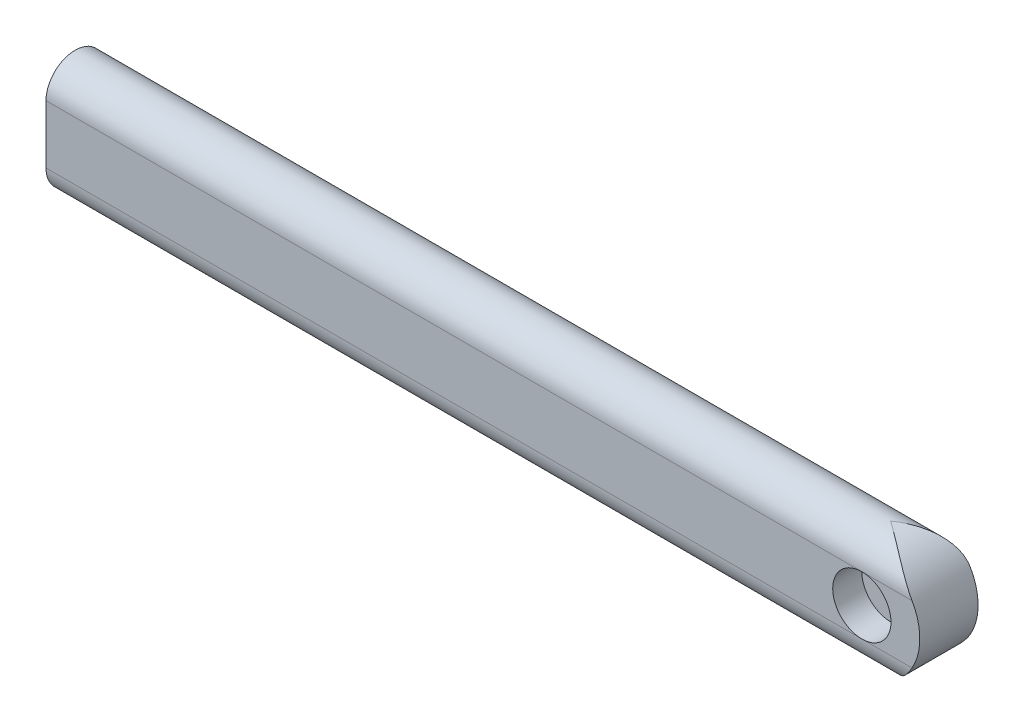
ISO-10303-21;
HEADER;
FILE_DESCRIPTION(('STEP AP214'),'2;1');
FILE_NAME('part.step','',(''),(''),'','','');
FILE_SCHEMA(('AUTOMOTIVE_DESIGN { 1 0 10303 214 1 1 1 1 }'));
ENDSEC;
DATA;
#1=APPLICATION_CONTEXT('core data for automotive mechanical design processes');
#2=APPLICATION_PROTOCOL_DEFINITION('international standard','automotive_design',2000,#1);
#3=PRODUCT_CONTEXT('',#1,'mechanical');
#4=PRODUCT('Part','Part','',(#3));
#5=PRODUCT_RELATED_PRODUCT_CATEGORY('part','',(#4));
#6=PRODUCT_DEFINITION_FORMATION('','',#4);
#7=PRODUCT_DEFINITION_CONTEXT('part definition',#1,'design');
#8=PRODUCT_DEFINITION('design','',#6,#7);
#9=PRODUCT_DEFINITION_SHAPE('','',#8);
#10=(LENGTH_UNIT() NAMED_UNIT(*) SI_UNIT(.MILLI.,.METRE.));
#11=(NAMED_UNIT(*) PLANE_ANGLE_UNIT() SI_UNIT($,.RADIAN.));
#12=(NAMED_UNIT(*) SI_UNIT($,.STERADIAN.) SOLID_ANGLE_UNIT());
#13=UNCERTAINTY_MEASURE_WITH_UNIT(LENGTH_MEASURE(1.E-05),#10,'distance_accuracy_value','');
#14=(GEOMETRIC_REPRESENTATION_CONTEXT(3) GLOBAL_UNCERTAINTY_ASSIGNED_CONTEXT((#13)) GLOBAL_UNIT_ASSIGNED_CONTEXT((#10,
#11,#12)) REPRESENTATION_CONTEXT('',''));
#15=CARTESIAN_POINT('',(0.,0.,0.));
#16=DIRECTION('',(0.,0.,1.));
#17=DIRECTION('',(1.,0.,0.));
#18=AXIS2_PLACEMENT_3D('',#15,#16,#17);
#19=CARTESIAN_POINT('',(-1500.,50.,50.));
#20=DIRECTION('',(0.,0.,1.));
#21=DIRECTION('',(0.,-1.,0.));
#22=AXIS2_PLACEMENT_3D('',#19,#20,#21);
#23=PLANE('',#22);
#24=CARTESIAN_POINT('',(-100.,0.,50.));
#25=DIRECTION('',(0.,0.,1.));
#26=DIRECTION('',(1.,0.,0.));
#27=AXIS2_PLACEMENT_3D('',#24,#25,#26);
#28=CIRCLE('',#27,50.);
#29=CARTESIAN_POINT('',(-100.,-50.,50.));
#30=VERTEX_POINT('',#29);
#31=CARTESIAN_POINT('',(-100.,50.,50.));
#32=VERTEX_POINT('',#31);
#33=EDGE_CURVE('E52',#30,#32,#28,.T.);
#34=ORIENTED_EDGE('',*,*,#33,.F.);
#35=DIRECTION('',(1.,0.,0.));
#36=VECTOR('',#35,1.);
#37=CARTESIAN_POINT('',(-1500.,-50.,50.));
#38=LINE('',#37,#36);
#39=CARTESIAN_POINT('',(-13.8974596215561,-50.,50.));
#40=VERTEX_POINT('',#39);
#41=EDGE_CURVE('E45',#30,#40,#38,.T.);
#42=ORIENTED_EDGE('',*,*,#41,.T.);
#43=CARTESIAN_POINT('',(-100.5,0.,50.));
#44=DIRECTION('',(0.,0.,-1.));
#45=DIRECTION('',(1.,0.,0.));
#46=AXIS2_PLACEMENT_3D('',#43,#44,#45);
#47=CIRCLE('',#46,100.);
#48=CARTESIAN_POINT('',(-13.8974596215561,50.,50.));
#49=VERTEX_POINT('',#48);
#50=EDGE_CURVE('E132',#49,#40,#47,.T.);
#51=ORIENTED_EDGE('',*,*,#50,.F.);
#52=DIRECTION('',(1.,0.,0.));
#53=VECTOR('',#52,1.);
#54=CARTESIAN_POINT('',(-1500.,50.,50.));
#55=LINE('',#54,#53);
#56=EDGE_CURVE('E98',#32,#49,#55,.T.);
#57=ORIENTED_EDGE('',*,*,#56,.F.);
#58=EDGE_LOOP('',(#34,#42,#51,#57));
#59=FACE_BOUND('',#58,.T.);
#60=ADVANCED_FACE('F35',(#59),#23,.T.);
#61=CARTESIAN_POINT('',(-1500.,-50.,0.));
#62=DIRECTION('',(1.,0.,0.));
#63=DIRECTION('',(0.,0.,-1.));
#64=AXIS2_PLACEMENT_3D('',#61,#62,#63);
#65=CYLINDRICAL_SURFACE('',#64,50.);
#66=CARTESIAN_POINT('',(-13.8974596215562,-50.,50.));
#67=CARTESIAN_POINT('',(-14.167649995854,-50.4679873555165,49.9999998007558));
#68=CARTESIAN_POINT('',(-14.4416192976185,-50.9337508197538,49.9934293962166));
#69=CARTESIAN_POINT('',(-14.9968959537458,-51.8604948890862,49.967523935161));
#70=CARTESIAN_POINT('',(-15.2782029459379,-52.3214757286762,49.9481895075052));
#71=CARTESIAN_POINT('',(-16.1325978948247,-53.6964189136298,49.8716245850319));
#72=CARTESIAN_POINT('',(-16.7163910138867,-54.6027822778373,49.7958318045643));
#73=CARTESIAN_POINT('',(-17.9089760109517,-56.3903774565486,49.5980837190025));
#74=CARTESIAN_POINT('',(-18.5177027707405,-57.2716656752587,49.4762425799509));
#75=CARTESIAN_POINT('',(-19.7596885694484,-59.0096854991582,49.1894434712583));
#76=CARTESIAN_POINT('',(-20.3929497718193,-59.8664149271058,49.0244816918261));
#77=CARTESIAN_POINT('',(-21.6734324213071,-61.5424205466508,48.6569489729919));
#78=CARTESIAN_POINT('',(-22.3203524005359,-62.3620451010419,48.4549125571254));
#79=CARTESIAN_POINT('',(-23.6345983823058,-63.9749356816395,48.0145823273887));
#80=CARTESIAN_POINT('',(-24.301927431845,-64.7681977347693,47.77628307829));
#81=CARTESIAN_POINT('',(-25.6556834610754,-66.3279375752905,47.265972624269));
#82=CARTESIAN_POINT('',(-26.3421215353475,-67.0943991943409,46.9939415043326));
#83=CARTESIAN_POINT('',(-27.7322208493559,-68.5995621094816,46.418804555539));
#84=CARTESIAN_POINT('',(-28.4358829638091,-69.3382619908515,46.1156971459805));
#85=CARTESIAN_POINT('',(-29.9942836260111,-70.9253464289168,45.4204403161706));
#86=CARTESIAN_POINT('',(-30.8523135346437,-71.7678878973594,45.0223175554328));
#87=CARTESIAN_POINT('',(-32.5885437497228,-73.412972602083,44.1891718645774));
#88=CARTESIAN_POINT('',(-33.4667449592446,-74.2155140424315,43.7541472799965));
#89=CARTESIAN_POINT('',(-35.241287803999,-75.7806039231371,42.8506342763267));
#90=CARTESIAN_POINT('',(-36.1376286506796,-76.5431540968095,42.3821473096583));
#91=CARTESIAN_POINT('',(-37.9465888555284,-78.0284608717307,41.414862420554));
#92=CARTESIAN_POINT('',(-38.859208066334,-78.7512178329724,40.9160647724124));
#93=CARTESIAN_POINT('',(-41.629644752215,-80.8684334056681,39.3726129429172));
#94=CARTESIAN_POINT('',(-43.5102509086547,-82.2032377531554,38.2859291021442));
#95=CARTESIAN_POINT('',(-46.3666719237667,-84.0885569833704,36.5880523705917));
#96=CARTESIAN_POINT('',(-47.3248624712819,-84.6975897381605,36.0107025499787));
#97=CARTESIAN_POINT('',(-49.252095763952,-85.8774035892217,34.8354004963423));
#98=CARTESIAN_POINT('',(-50.2211378955535,-86.4481868355201,34.237449424193));
#99=CARTESIAN_POINT('',(-52.5638959694379,-87.7758833274168,32.7767150034322));
#100=CARTESIAN_POINT('',(-53.9423825832557,-88.5144293506564,31.9048545880584));
#101=CARTESIAN_POINT('',(-56.7159516976898,-89.9187050026086,30.1293572271052));
#102=CARTESIAN_POINT('',(-58.1110355527095,-90.5844286428923,29.2257176762832));
#103=CARTESIAN_POINT('',(-60.9158757936792,-91.8447706031514,27.3907738433912));
#104=CARTESIAN_POINT('',(-62.3256375455657,-92.4393618499793,26.4594591954103));
#105=CARTESIAN_POINT('',(-65.1571628008992,-93.5585450068019,24.5734715087283));
#106=CARTESIAN_POINT('',(-66.5789260078213,-94.0831386409053,23.6187990460383));
#107=CARTESIAN_POINT('',(-69.4304490146796,-95.0628860868514,21.6910925669564));
#108=CARTESIAN_POINT('',(-70.8601934012765,-95.5181440901881,20.7180886203565));
#109=CARTESIAN_POINT('',(-73.7281443395045,-96.3613085907926,18.7555250353954));
#110=CARTESIAN_POINT('',(-75.166350991151,-96.7492142903645,17.7659652011045));
#111=CARTESIAN_POINT('',(-78.0490582952812,-97.4584912488702,15.7736862170675));
#112=CARTESIAN_POINT('',(-79.4935559060582,-97.7798916545224,14.7709730376944));
#113=CARTESIAN_POINT('',(-82.3879681042622,-98.3571646001634,12.7547679094376));
#114=CARTESIAN_POINT('',(-83.8378825418874,-98.6130389388549,11.7412762572206));
#115=CARTESIAN_POINT('',(-87.8092096569154,-99.2242019805822,8.95803071512362));
#116=CARTESIAN_POINT('',(-90.3349825432086,-99.5143537722498,7.17987598843417));
#117=CARTESIAN_POINT('',(-95.3901714975246,-99.9014908608122,3.61316996350912));
#118=CARTESIAN_POINT('',(-97.9195808435879,-99.9986810635289,1.82463171855725));
#119=CARTESIAN_POINT('',(-100.46557351057,-99.9999955538482,0.0243432040216313));
#120=CARTESIAN_POINT('',(-100.482786770477,-99.9999999982519,0.0121715912153314));
#121=CARTESIAN_POINT('',(-100.5,-100.,0.));
#122=B_SPLINE_CURVE_WITH_KNOTS('',3,(#66,#67,#68,#69,#70,#71,#72,#73,#74,#75,#76,#77,#78,#79,
#80,#81,#82,#83,#84,#85,#86,#87,#88,#89,#90,#91,#92,#93,#94,#95,#96,#97,#98,#99,#100,#101,#102,
#103,#104,#105,#106,#107,#108,#109,#110,#111,#112,#113,#114,#115,#116,#117,#118,#119,#120,#121),
.UNSPECIFIED.,.F.,.F.,(4,2,2,2,2,2,2,2,2,2,2,2,2,2,2,2,2,2,2,2,2,2,2,2,2,2,2,4),(0.,
1.62102700094339,3.24197414274325,6.48248351501531,9.71501095859343,12.9478240987529,
16.1372452280161,19.3271448730606,22.5189368559038,25.7108912704764,29.5096175956622,
33.3085143237615,37.1072462624503,40.9059438299177,48.545122542519,52.3657422350112,
56.1861469877789,61.5555727104082,66.9254396475331,72.2973439093095,77.6691158314684,
83.0327341419506,88.3964159728232,93.7577421056175,99.1189210532384,108.420116135872,
117.71142898975,117.774674544358),.UNSPECIFIED.);
#123=CARTESIAN_POINT('',(-100.5,-100.,0.));
#124=VERTEX_POINT('',#123);
#125=EDGE_CURVE('E105',#40,#124,#122,.T.);
#126=ORIENTED_EDGE('',*,*,#125,.F.);
#127=ORIENTED_EDGE('',*,*,#41,.F.);
#128=CARTESIAN_POINT('',(-1500.,-50.,50.));
#129=VERTEX_POINT('',#128);
#130=EDGE_CURVE('E11',#129,#30,#38,.T.);
#131=ORIENTED_EDGE('',*,*,#130,.F.);
#132=CARTESIAN_POINT('',(-1500.,-50.,0.));
#133=DIRECTION('',(1.,0.,0.));
#134=DIRECTION('',(0.,0.,-1.));
#135=AXIS2_PLACEMENT_3D('',#132,#133,#134);
#136=CIRCLE('',#135,50.);
#137=CARTESIAN_POINT('',(-1500.,-50.,-50.));
#138=VERTEX_POINT('',#137);
#139=EDGE_CURVE('E267',#129,#138,#136,.T.);
#140=ORIENTED_EDGE('',*,*,#139,.T.);
#141=DIRECTION('',(1.,0.,0.));
#142=VECTOR('',#141,1.);
#143=CARTESIAN_POINT('',(-1500.,-50.,-50.));
#144=LINE('',#143,#142);
#145=CARTESIAN_POINT('',(-13.8974596215561,-50.,-50.));
#146=VERTEX_POINT('',#145);
#147=EDGE_CURVE('E40',#138,#146,#144,.T.);
#148=ORIENTED_EDGE('',*,*,#147,.T.);
#149=CARTESIAN_POINT('',(-13.8974596215562,-50.,-50.));
#150=CARTESIAN_POINT('',(-14.167649995854,-50.4679873555165,-49.9999998007558));
#151=CARTESIAN_POINT('',(-14.4416192976185,-50.9337508197538,-49.9934293962166));
#152=CARTESIAN_POINT('',(-14.9968959537458,-51.8604948890862,-49.967523935161));
#153=CARTESIAN_POINT('',(-15.2782029459379,-52.3214757286762,-49.9481895075052));
#154=CARTESIAN_POINT('',(-16.1325978948247,-53.6964189136298,-49.8716245850319));
#155=CARTESIAN_POINT('',(-16.7163910138867,-54.6027822778373,-49.7958318045643));
#156=CARTESIAN_POINT('',(-17.9089760109517,-56.3903774565486,-49.5980837190025));
#157=CARTESIAN_POINT('',(-18.5177027707405,-57.2716656752587,-49.4762425799509));
#158=CARTESIAN_POINT('',(-19.7596885694484,-59.0096854991581,-49.1894434712583));
#159=CARTESIAN_POINT('',(-20.3929497718193,-59.8664149271058,-49.0244816918261));
#160=CARTESIAN_POINT('',(-21.6734324213071,-61.5424205466508,-48.6569489729919));
#161=CARTESIAN_POINT('',(-22.3203524005359,-62.3620451010419,-48.4549125571255));
#162=CARTESIAN_POINT('',(-23.6345983823058,-63.9749356816395,-48.0145823273887));
#163=CARTESIAN_POINT('',(-24.301927431845,-64.7681977347693,-47.77628307829));
#164=CARTESIAN_POINT('',(-25.6556834610754,-66.3279375752905,-47.265972624269));
#165=CARTESIAN_POINT('',(-26.3421215353475,-67.0943991943409,-46.9939415043326));
#166=CARTESIAN_POINT('',(-27.7322208493559,-68.5995621094816,-46.4188045555391));
#167=CARTESIAN_POINT('',(-28.4358829638091,-69.3382619908515,-46.1156971459805));
#168=CARTESIAN_POINT('',(-29.9942836260111,-70.9253464289168,-45.4204403161706));
#169=CARTESIAN_POINT('',(-30.8523135346437,-71.7678878973595,-45.0223175554328));
#170=CARTESIAN_POINT('',(-32.5885437497228,-73.412972602083,-44.1891718645774));
#171=CARTESIAN_POINT('',(-33.4667449592446,-74.2155140424316,-43.7541472799965));
#172=CARTESIAN_POINT('',(-35.241287803999,-75.7806039231371,-42.8506342763267));
#173=CARTESIAN_POINT('',(-36.1376286506796,-76.5431540968095,-42.3821473096583));
#174=CARTESIAN_POINT('',(-37.9465888555284,-78.0284608717307,-41.414862420554));
#175=CARTESIAN_POINT('',(-38.8592080663341,-78.7512178329724,-40.9160647724124));
#176=CARTESIAN_POINT('',(-41.6296447522151,-80.8684334056681,-39.3726129429172));
#177=CARTESIAN_POINT('',(-43.5102509086547,-82.2032377531554,-38.2859291021442));
#178=CARTESIAN_POINT('',(-46.3666719237668,-84.0885569833704,-36.5880523705917));
#179=CARTESIAN_POINT('',(-47.3248624712819,-84.6975897381605,-36.0107025499787));
#180=CARTESIAN_POINT('',(-49.2520957639521,-85.8774035892217,-34.8354004963423));
#181=CARTESIAN_POINT('',(-50.2211378955535,-86.4481868355201,-34.237449424193));
#182=CARTESIAN_POINT('',(-52.5638959694379,-87.7758833274168,-32.7767150034322));
#183=CARTESIAN_POINT('',(-53.9423825832557,-88.5144293506564,-31.9048545880584));
#184=CARTESIAN_POINT('',(-56.7159516976898,-89.9187050026086,-30.1293572271052));
#185=CARTESIAN_POINT('',(-58.1110355527095,-90.5844286428923,-29.2257176762832));
#186=CARTESIAN_POINT('',(-60.9158757936792,-91.8447706031514,-27.3907738433912));
#187=CARTESIAN_POINT('',(-62.3256375455657,-92.4393618499793,-26.4594591954103));
#188=CARTESIAN_POINT('',(-65.1571628008992,-93.5585450068019,-24.5734715087283));
#189=CARTESIAN_POINT('',(-66.5789260078213,-94.0831386409053,-23.6187990460383));
#190=CARTESIAN_POINT('',(-69.4304490146797,-95.0628860868514,-21.6910925669564));
#191=CARTESIAN_POINT('',(-70.8601934012765,-95.5181440901882,-20.7180886203565));
#192=CARTESIAN_POINT('',(-73.7281443395045,-96.3613085907926,-18.7555250353954));
#193=CARTESIAN_POINT('',(-75.166350991151,-96.7492142903645,-17.7659652011045));
#194=CARTESIAN_POINT('',(-78.0490582952813,-97.4584912488702,-15.7736862170675));
#195=CARTESIAN_POINT('',(-79.4935559060582,-97.7798916545224,-14.7709730376943));
#196=CARTESIAN_POINT('',(-82.3879681042621,-98.3571646001634,-12.7547679094376));
#197=CARTESIAN_POINT('',(-83.8378825418874,-98.6130389388549,-11.7412762572206));
#198=CARTESIAN_POINT('',(-87.8092096569154,-99.2242019805822,-8.95803071512362));
#199=CARTESIAN_POINT('',(-90.3349825432084,-99.5143537722498,-7.17987598843404));
#200=CARTESIAN_POINT('',(-95.3901714975245,-99.9014908608122,-3.61316996350912));
#201=CARTESIAN_POINT('',(-97.9195808435881,-99.9986810635289,-1.82463171855753));
#202=CARTESIAN_POINT('',(-100.46557351057,-99.9999955538482,-0.0243432040216504));
#203=CARTESIAN_POINT('',(-100.482786770477,-99.9999999982519,-0.0121715912153479));
#204=CARTESIAN_POINT('',(-100.5,-100.,0.));
#205=B_SPLINE_CURVE_WITH_KNOTS('',3,(#149,#150,#151,#152,#153,#154,#155,#156,#157,#158,#159,
#160,#161,#162,#163,#164,#165,#166,#167,#168,#169,#170,#171,#172,#173,#174,#175,#176,#177,#178,
#179,#180,#181,#182,#183,#184,#185,#186,#187,#188,#189,#190,#191,#192,#193,#194,#195,#196,#197,
#198,#199,#200,#201,#202,#203,#204),.UNSPECIFIED.,.F.,.F.,(4,2,2,2,2,2,2,2,2,2,2,2,2,2,2,2,2,2,
2,2,2,2,2,2,2,2,2,4),(0.,1.62102700094338,3.24197414274325,6.48248351501531,9.71501095859341,
12.9478240987529,16.1372452280161,19.3271448730606,22.5189368559038,25.7108912704764,
29.5096175956622,33.3085143237615,37.1072462624503,40.9059438299177,48.545122542519,
52.3657422350112,56.186146987779,61.5555727104082,66.9254396475331,72.2973439093095,
77.6691158314684,83.0327341419506,88.3964159728232,93.7577421056175,99.1189210532384,
108.420116135871,117.71142898975,117.774674544358),.UNSPECIFIED.);
#206=EDGE_CURVE('E60',#124,#146,#205,.F.);
#207=ORIENTED_EDGE('',*,*,#206,.F.);
#208=EDGE_LOOP('',(#126,#127,#131,#140,#148,#207));
#209=FACE_BOUND('',#208,.T.);
#210=ADVANCED_FACE('F37',(#209),#65,.T.);
#211=EDGE_CURVE('E88',#32,#30,#28,.T.);
#212=ORIENTED_EDGE('',*,*,#211,.F.);
#213=CARTESIAN_POINT('',(-1500.,50.,50.));
#214=VERTEX_POINT('',#213);
#215=EDGE_CURVE('E106',#214,#32,#55,.T.);
#216=ORIENTED_EDGE('',*,*,#215,.F.);
#217=DIRECTION('',(0.,-1.,0.));
#218=VECTOR('',#217,1.);
#219=CARTESIAN_POINT('',(-1500.,50.,50.));
#220=LINE('',#219,#218);
#221=EDGE_CURVE('E110',#214,#129,#220,.T.);
#222=ORIENTED_EDGE('',*,*,#221,.T.);
#223=ORIENTED_EDGE('',*,*,#130,.T.);
#224=EDGE_LOOP('',(#212,#216,#222,#223));
#225=FACE_BOUND('',#224,.T.);
#226=ADVANCED_FACE('F108',(#225),#23,.T.);
#227=CARTESIAN_POINT('',(-1500.,50.,0.));
#228=DIRECTION('',(1.,0.,0.));
#229=DIRECTION('',(0.,0.,-1.));
#230=AXIS2_PLACEMENT_3D('',#227,#228,#229);
#231=CYLINDRICAL_SURFACE('',#230,50.);
#232=CARTESIAN_POINT('',(-13.8974596215562,50.,-50.));
#233=CARTESIAN_POINT('',(-14.167649995854,50.4679873555165,-49.9999998007558));
#234=CARTESIAN_POINT('',(-14.4416192976185,50.9337508197537,-49.9934293962166));
#235=CARTESIAN_POINT('',(-14.9968959537458,51.8604948890861,-49.967523935161));
#236=CARTESIAN_POINT('',(-15.2782029459379,52.3214757286762,-49.9481895075052));
#237=CARTESIAN_POINT('',(-16.1325978948247,53.6964189136297,-49.8716245850319));
#238=CARTESIAN_POINT('',(-16.7163910138867,54.6027822778372,-49.7958318045643));
#239=CARTESIAN_POINT('',(-17.9089760109516,56.3903774565485,-49.5980837190026));
#240=CARTESIAN_POINT('',(-18.5177027707404,57.2716656752585,-49.4762425799509));
#241=CARTESIAN_POINT('',(-19.7596885694482,59.0096854991579,-49.1894434712583));
#242=CARTESIAN_POINT('',(-20.3929497718191,59.8664149271056,-49.0244816918262));
#243=CARTESIAN_POINT('',(-21.6734324213069,61.5424205466505,-48.6569489729919));
#244=CARTESIAN_POINT('',(-22.3203524005357,62.3620451010417,-48.4549125571255));
#245=CARTESIAN_POINT('',(-23.6345983823057,63.9749356816393,-48.0145823273887));
#246=CARTESIAN_POINT('',(-24.3019274318449,64.7681977347692,-47.77628307829));
#247=CARTESIAN_POINT('',(-25.6556834610753,66.3279375752904,-47.265972624269));
#248=CARTESIAN_POINT('',(-26.3421215353474,67.0943991943408,-46.9939415043326));
#249=CARTESIAN_POINT('',(-27.7322208493559,68.5995621094816,-46.4188045555391));
#250=CARTESIAN_POINT('',(-28.4358829638091,69.3382619908515,-46.1156971459805));
#251=CARTESIAN_POINT('',(-29.9942836260111,70.9253464289168,-45.4204403161706));
#252=CARTESIAN_POINT('',(-30.8523135346437,71.7678878973595,-45.0223175554328));
#253=CARTESIAN_POINT('',(-32.5885437497228,73.412972602083,-44.1891718645774));
#254=CARTESIAN_POINT('',(-33.4667449592446,74.2155140424316,-43.7541472799965));
#255=CARTESIAN_POINT('',(-35.241287803999,75.7806039231371,-42.8506342763267));
#256=CARTESIAN_POINT('',(-36.1376286506796,76.5431540968096,-42.3821473096583));
#257=CARTESIAN_POINT('',(-37.9465888555285,78.0284608717308,-41.414862420554));
#258=CARTESIAN_POINT('',(-38.8592080663342,78.7512178329725,-40.9160647724123));
#259=CARTESIAN_POINT('',(-41.6296447522152,80.8684334056681,-39.3726129429171));
#260=CARTESIAN_POINT('',(-43.5102509086548,82.2032377531554,-38.2859291021442));
#261=CARTESIAN_POINT('',(-46.3666719237668,84.0885569833704,-36.5880523705916));
#262=CARTESIAN_POINT('',(-47.324862471282,84.6975897381605,-36.0107025499786));
#263=CARTESIAN_POINT('',(-49.2520957639521,85.8774035892217,-34.8354004963423));
#264=CARTESIAN_POINT('',(-50.2211378955535,86.4481868355201,-34.237449424193));
#265=CARTESIAN_POINT('',(-52.5638959694379,87.7758833274168,-32.7767150034322));
#266=CARTESIAN_POINT('',(-53.9423825832557,88.5144293506563,-31.9048545880584));
#267=CARTESIAN_POINT('',(-56.7159516976898,89.9187050026086,-30.1293572271052));
#268=CARTESIAN_POINT('',(-58.1110355527095,90.5844286428923,-29.2257176762832));
#269=CARTESIAN_POINT('',(-60.9158757936791,91.8447706031514,-27.3907738433912));
#270=CARTESIAN_POINT('',(-62.3256375455656,92.4393618499793,-26.4594591954103));
#271=CARTESIAN_POINT('',(-65.1571628008991,93.5585450068019,-24.5734715087284));
#272=CARTESIAN_POINT('',(-66.5789260078212,94.0831386409053,-23.6187990460384));
#273=CARTESIAN_POINT('',(-69.4304490146796,95.0628860868514,-21.6910925669565));
#274=CARTESIAN_POINT('',(-70.8601934012764,95.5181440901881,-20.7180886203566));
#275=CARTESIAN_POINT('',(-73.7281443395044,96.3613085907926,-18.7555250353955));
#276=CARTESIAN_POINT('',(-75.1663509911509,96.7492142903644,-17.7659652011046));
#277=CARTESIAN_POINT('',(-78.0490582952812,97.4584912488702,-15.7736862170674));
#278=CARTESIAN_POINT('',(-79.493555906058,97.7798916545224,-14.7709730376942));
#279=CARTESIAN_POINT('',(-82.3879681042621,98.3571646001634,-12.7547679094376));
#280=CARTESIAN_POINT('',(-83.8378825418876,98.6130389388549,-11.7412762572209));
#281=CARTESIAN_POINT('',(-87.8092096569148,99.2242019805822,-8.95803071512287));
#282=CARTESIAN_POINT('',(-90.3349825432059,99.51435377225,-7.17987598843052));
#283=CARTESIAN_POINT('',(-95.3901714975268,99.901490860812,-3.61316996351253));
#284=CARTESIAN_POINT('',(-97.9195808435973,99.9986810635282,-1.8246317185706));
#285=CARTESIAN_POINT('',(-100.46557351057,99.9999955538481,-0.0243432040218492));
#286=CARTESIAN_POINT('',(-100.482786770477,99.9999999982519,-0.0121715912154409));
#287=CARTESIAN_POINT('',(-100.5,100.,0.));
#288=B_SPLINE_CURVE_WITH_KNOTS('',3,(#232,#233,#234,#235,#236,#237,#238,#239,#240,#241,#242,
#243,#244,#245,#246,#247,#248,#249,#250,#251,#252,#253,#254,#255,#256,#257,#258,#259,#260,#261,
#262,#263,#264,#265,#266,#267,#268,#269,#270,#271,#272,#273,#274,#275,#276,#277,#278,#279,#280,
#281,#282,#283,#284,#285,#286,#287),.UNSPECIFIED.,.F.,.F.,(4,2,2,2,2,2,2,2,2,2,2,2,2,2,2,2,2,2,
2,2,2,2,2,2,2,2,2,4),(0.,1.62102700094334,3.24197414274317,6.48248351501515,9.71501095859318,
12.9478240987526,16.1372452280159,19.3271448730605,22.5189368559037,25.7108912704764,
29.5096175956622,33.3085143237615,37.1072462624504,40.9059438299179,48.5451225425191,
52.3657422350113,56.186146987779,61.5555727104081,66.9254396475331,72.2973439093094,
77.6691158314682,83.0327341419504,88.3964159728231,93.7577421056174,99.1189210532383,
108.420116135871,117.71142898975,117.774674544358),.UNSPECIFIED.);
#289=CARTESIAN_POINT('',(-13.8974596215561,50.,-50.));
#290=VERTEX_POINT('',#289);
#291=CARTESIAN_POINT('',(-100.5,100.,0.));
#292=VERTEX_POINT('',#291);
#293=EDGE_CURVE('E133',#290,#292,#288,.T.);
#294=ORIENTED_EDGE('',*,*,#293,.F.);
#295=DIRECTION('',(1.,0.,0.));
#296=VECTOR('',#295,1.);
#297=CARTESIAN_POINT('',(-1500.,50.,-50.));
#298=LINE('',#297,#296);
#299=CARTESIAN_POINT('',(-1500.,50.,-50.));
#300=VERTEX_POINT('',#299);
#301=EDGE_CURVE('E117',#300,#290,#298,.T.);
#302=ORIENTED_EDGE('',*,*,#301,.F.);
#303=CARTESIAN_POINT('',(-1500.,50.,0.));
#304=DIRECTION('',(1.,0.,0.));
#305=DIRECTION('',(0.,0.,-1.));
#306=AXIS2_PLACEMENT_3D('',#303,#304,#305);
#307=CIRCLE('',#306,50.);
#308=EDGE_CURVE('E114',#300,#214,#307,.T.);
#309=ORIENTED_EDGE('',*,*,#308,.T.);
#310=ORIENTED_EDGE('',*,*,#215,.T.);
#311=ORIENTED_EDGE('',*,*,#56,.T.);
#312=CARTESIAN_POINT('',(-13.8974596215562,50.,50.));
#313=CARTESIAN_POINT('',(-14.167649995854,50.4679873555165,49.9999998007558));
#314=CARTESIAN_POINT('',(-14.4416192976185,50.9337508197537,49.9934293962166));
#315=CARTESIAN_POINT('',(-14.9968959537458,51.8604948890861,49.967523935161));
#316=CARTESIAN_POINT('',(-15.2782029459379,52.3214757286762,49.9481895075052));
#317=CARTESIAN_POINT('',(-16.1325978948247,53.6964189136297,49.8716245850319));
#318=CARTESIAN_POINT('',(-16.7163910138867,54.6027822778372,49.7958318045643));
#319=CARTESIAN_POINT('',(-17.9089760109516,56.3903774565485,49.5980837190026));
#320=CARTESIAN_POINT('',(-18.5177027707404,57.2716656752585,49.4762425799509));
#321=CARTESIAN_POINT('',(-19.7596885694482,59.0096854991579,49.1894434712583));
#322=CARTESIAN_POINT('',(-20.3929497718191,59.8664149271056,49.0244816918262));
#323=CARTESIAN_POINT('',(-21.6734324213069,61.5424205466505,48.6569489729919));
#324=CARTESIAN_POINT('',(-22.3203524005357,62.3620451010417,48.4549125571255));
#325=CARTESIAN_POINT('',(-23.6345983823057,63.9749356816394,48.0145823273888));
#326=CARTESIAN_POINT('',(-24.3019274318449,64.7681977347692,47.77628307829));
#327=CARTESIAN_POINT('',(-25.6556834610753,66.3279375752904,47.265972624269));
#328=CARTESIAN_POINT('',(-26.3421215353474,67.0943991943409,46.9939415043326));
#329=CARTESIAN_POINT('',(-27.7322208493559,68.5995621094816,46.4188045555391));
#330=CARTESIAN_POINT('',(-28.4358829638091,69.3382619908515,46.1156971459805));
#331=CARTESIAN_POINT('',(-29.9942836260111,70.9253464289168,45.4204403161706));
#332=CARTESIAN_POINT('',(-30.8523135346437,71.7678878973595,45.0223175554328));
#333=CARTESIAN_POINT('',(-32.5885437497228,73.4129726020831,44.1891718645774));
#334=CARTESIAN_POINT('',(-33.4667449592446,74.2155140424316,43.7541472799965));
#335=CARTESIAN_POINT('',(-35.241287803999,75.7806039231372,42.8506342763267));
#336=CARTESIAN_POINT('',(-36.1376286506796,76.5431540968096,42.3821473096583));
#337=CARTESIAN_POINT('',(-37.9465888555285,78.0284608717308,41.414862420554));
#338=CARTESIAN_POINT('',(-38.8592080663342,78.7512178329725,40.9160647724123));
#339=CARTESIAN_POINT('',(-41.6296447522152,80.8684334056681,39.3726129429171));
#340=CARTESIAN_POINT('',(-43.5102509086548,82.2032377531554,38.2859291021442));
#341=CARTESIAN_POINT('',(-46.3666719237668,84.0885569833704,36.5880523705916));
#342=CARTESIAN_POINT('',(-47.3248624712819,84.6975897381605,36.0107025499786));
#343=CARTESIAN_POINT('',(-49.2520957639521,85.8774035892217,34.8354004963423));
#344=CARTESIAN_POINT('',(-50.2211378955535,86.4481868355201,34.237449424193));
#345=CARTESIAN_POINT('',(-52.5638959694379,87.7758833274168,32.7767150034322));
#346=CARTESIAN_POINT('',(-53.9423825832557,88.5144293506563,31.9048545880584));
#347=CARTESIAN_POINT('',(-56.7159516976898,89.9187050026086,30.1293572271052));
#348=CARTESIAN_POINT('',(-58.1110355527095,90.5844286428923,29.2257176762832));
#349=CARTESIAN_POINT('',(-60.9158757936792,91.8447706031514,27.3907738433912));
#350=CARTESIAN_POINT('',(-62.3256375455657,92.4393618499793,26.4594591954104));
#351=CARTESIAN_POINT('',(-65.1571628008991,93.5585450068019,24.5734715087284));
#352=CARTESIAN_POINT('',(-66.5789260078212,94.0831386409053,23.6187990460384));
#353=CARTESIAN_POINT('',(-69.4304490146796,95.0628860868514,21.6910925669565));
#354=CARTESIAN_POINT('',(-70.8601934012764,95.5181440901881,20.7180886203566));
#355=CARTESIAN_POINT('',(-73.7281443395044,96.3613085907926,18.7555250353955));
#356=CARTESIAN_POINT('',(-75.166350991151,96.7492142903644,17.7659652011046));
#357=CARTESIAN_POINT('',(-78.0490582952812,97.4584912488702,15.7736862170674));
#358=CARTESIAN_POINT('',(-79.4935559060581,97.7798916545224,14.7709730376942));
#359=CARTESIAN_POINT('',(-82.3879681042622,98.3571646001634,12.7547679094376));
#360=CARTESIAN_POINT('',(-83.8378825418877,98.6130389388549,11.7412762572209));
#361=CARTESIAN_POINT('',(-87.8092096569148,99.2242019805822,8.95803071512283));
#362=CARTESIAN_POINT('',(-90.3349825432058,99.51435377225,7.17987598843043));
#363=CARTESIAN_POINT('',(-95.3901714975269,99.901490860812,3.61316996351262));
#364=CARTESIAN_POINT('',(-97.9195808435975,99.9986810635282,1.82463171857092));
#365=CARTESIAN_POINT('',(-100.46557351057,99.9999955538481,0.0243432040218691));
#366=CARTESIAN_POINT('',(-100.482786770477,99.9999999982519,0.0121715912154578));
#367=CARTESIAN_POINT('',(-100.5,100.,0.));
#368=B_SPLINE_CURVE_WITH_KNOTS('',3,(#312,#313,#314,#315,#316,#317,#318,#319,#320,#321,#322,
#323,#324,#325,#326,#327,#328,#329,#330,#331,#332,#333,#334,#335,#336,#337,#338,#339,#340,#341,
#342,#343,#344,#345,#346,#347,#348,#349,#350,#351,#352,#353,#354,#355,#356,#357,#358,#359,#360,
#361,#362,#363,#364,#365,#366,#367),.UNSPECIFIED.,.F.,.F.,(4,2,2,2,2,2,2,2,2,2,2,2,2,2,2,2,2,2,
2,2,2,2,2,2,2,2,2,4),(0.,1.62102700094334,3.24197414274317,6.48248351501515,9.71501095859318,
12.9478240987526,16.1372452280159,19.3271448730605,22.5189368559037,25.7108912704764,
29.5096175956622,33.3085143237615,37.1072462624504,40.9059438299179,48.5451225425191,
52.3657422350113,56.186146987779,61.5555727104081,66.9254396475331,72.2973439093094,
77.6691158314683,83.0327341419505,88.3964159728232,93.7577421056175,99.1189210532384,
108.420116135871,117.71142898975,117.774674544358),.UNSPECIFIED.);
#369=EDGE_CURVE('E130',#292,#49,#368,.F.);
#370=ORIENTED_EDGE('',*,*,#369,.F.);
#371=EDGE_LOOP('',(#294,#302,#309,#310,#311,#370));
#372=FACE_BOUND('',#371,.T.);
#373=ADVANCED_FACE('F129',(#372),#231,.T.);
#374=CARTESIAN_POINT('',(-1500.,50.,-50.));
#375=DIRECTION('',(0.,0.,-1.));
#376=DIRECTION('',(0.,1.,0.));
#377=AXIS2_PLACEMENT_3D('',#374,#375,#376);
#378=PLANE('',#377);
#379=CARTESIAN_POINT('',(-100.5,0.,-50.));
#380=DIRECTION('',(0.,0.,-1.));
#381=DIRECTION('',(1.,0.,0.));
#382=AXIS2_PLACEMENT_3D('',#379,#380,#381);
#383=CIRCLE('',#382,100.);
#384=EDGE_CURVE('E134',#290,#146,#383,.T.);
#385=ORIENTED_EDGE('',*,*,#384,.T.);
#386=ORIENTED_EDGE('',*,*,#147,.F.);
#387=DIRECTION('',(0.,1.,0.));
#388=VECTOR('',#387,1.);
#389=CARTESIAN_POINT('',(-1500.,50.,-50.));
#390=LINE('',#389,#388);
#391=EDGE_CURVE('E118',#138,#300,#390,.T.);
#392=ORIENTED_EDGE('',*,*,#391,.T.);
#393=ORIENTED_EDGE('',*,*,#301,.T.);
#394=EDGE_LOOP('',(#385,#386,#392,#393));
#395=FACE_BOUND('',#394,.T.);
#396=ADVANCED_FACE('F158',(#395),#378,.T.);
#397=CARTESIAN_POINT('',(-1500.,-50.,0.));
#398=DIRECTION('',(1.,0.,0.));
#399=DIRECTION('',(0.,0.,-1.));
#400=AXIS2_PLACEMENT_3D('',#397,#398,#399);
#401=PLANE('',#400);
#402=CARTESIAN_POINT('',(-1500.,50.,0.));
#403=DIRECTION('',(-1.,0.,0.));
#404=DIRECTION('',(0.,0.,1.));
#405=AXIS2_PLACEMENT_3D('',#402,#403,#404);
#406=CIRCLE('',#405,25.);
#407=CARTESIAN_POINT('',(-1500.,50.,25.));
#408=VERTEX_POINT('',#407);
#409=EDGE_CURVE('E253',#408,#408,#406,.T.);
#410=ORIENTED_EDGE('',*,*,#409,.F.);
#411=EDGE_LOOP('',(#410));
#412=FACE_BOUND('',#411,.T.);
#413=CARTESIAN_POINT('',(-1500.,-50.,0.));
#414=DIRECTION('',(-1.,0.,0.));
#415=DIRECTION('',(0.,0.,1.));
#416=AXIS2_PLACEMENT_3D('',#413,#414,#415);
#417=CIRCLE('',#416,25.);
#418=CARTESIAN_POINT('',(-1500.,-50.,25.));
#419=VERTEX_POINT('',#418);
#420=EDGE_CURVE('E261',#419,#419,#417,.T.);
#421=ORIENTED_EDGE('',*,*,#420,.F.);
#422=EDGE_LOOP('',(#421));
#423=FACE_BOUND('',#422,.T.);
#424=ORIENTED_EDGE('',*,*,#139,.F.);
#425=ORIENTED_EDGE('',*,*,#221,.F.);
#426=ORIENTED_EDGE('',*,*,#308,.F.);
#427=ORIENTED_EDGE('',*,*,#391,.F.);
#428=EDGE_LOOP('',(#424,#425,#426,#427));
#429=FACE_BOUND('',#428,.T.);
#430=ADVANCED_FACE('F161',(#412,#423,#429),#401,.F.);
#431=CARTESIAN_POINT('',(-100.5,0.,-50.));
#432=DIRECTION('',(0.,0.,1.));
#433=DIRECTION('',(1.,0.,0.));
#434=AXIS2_PLACEMENT_3D('',#431,#432,#433);
#435=CYLINDRICAL_SURFACE('',#434,100.);
#436=ORIENTED_EDGE('',*,*,#125,.T.);
#437=ORIENTED_EDGE('',*,*,#206,.T.);
#438=ORIENTED_EDGE('',*,*,#384,.F.);
#439=ORIENTED_EDGE('',*,*,#293,.T.);
#440=ORIENTED_EDGE('',*,*,#369,.T.);
#441=ORIENTED_EDGE('',*,*,#50,.T.);
#442=EDGE_LOOP('',(#436,#437,#438,#439,#440,#441));
#443=FACE_BOUND('',#442,.T.);
#444=ADVANCED_FACE('F131',(#443),#435,.T.);
#445=CARTESIAN_POINT('',(-100.,0.,0.));
#446=DIRECTION('',(0.,0.,1.));
#447=DIRECTION('',(1.,0.,0.));
#448=AXIS2_PLACEMENT_3D('',#445,#446,#447);
#449=CYLINDRICAL_SURFACE('',#448,50.);
#450=CARTESIAN_POINT('',(-100.,0.,0.));
#451=DIRECTION('',(0.,0.,1.));
#452=DIRECTION('',(1.,0.,0.));
#453=AXIS2_PLACEMENT_3D('',#450,#451,#452);
#454=CIRCLE('',#453,50.);
#455=CARTESIAN_POINT('',(-50.,0.,0.));
#456=VERTEX_POINT('',#455);
#457=EDGE_CURVE('E92',#456,#456,#454,.T.);
#458=ORIENTED_EDGE('',*,*,#457,.F.);
#459=EDGE_LOOP('',(#458));
#460=FACE_BOUND('',#459,.T.);
#461=ORIENTED_EDGE('',*,*,#211,.T.);
#462=ORIENTED_EDGE('',*,*,#33,.T.);
#463=EDGE_LOOP('',(#461,#462));
#464=FACE_BOUND('',#463,.T.);
#465=ADVANCED_FACE('F89',(#460,#464),#449,.F.);
#466=CARTESIAN_POINT('',(-100.,0.,0.));
#467=DIRECTION('',(0.,0.,1.));
#468=DIRECTION('',(1.,0.,0.));
#469=AXIS2_PLACEMENT_3D('',#466,#467,#468);
#470=PLANE('',#469);
#471=ORIENTED_EDGE('',*,*,#457,.T.);
#472=EDGE_LOOP('',(#471));
#473=FACE_BOUND('',#472,.T.);
#474=ADVANCED_FACE('F189',(#473),#470,.T.);
#475=CARTESIAN_POINT('',(-1475.,-50.,0.));
#476=DIRECTION('',(-1.,0.,0.));
#477=DIRECTION('',(0.,0.,1.));
#478=AXIS2_PLACEMENT_3D('',#475,#476,#477);
#479=CYLINDRICAL_SURFACE('',#478,25.);
#480=CARTESIAN_POINT('',(-1475.,-50.,0.));
#481=DIRECTION('',(-1.,0.,0.));
#482=DIRECTION('',(0.,0.,1.));
#483=AXIS2_PLACEMENT_3D('',#480,#481,#482);
#484=CIRCLE('',#483,25.);
#485=CARTESIAN_POINT('',(-1475.,-50.,25.));
#486=VERTEX_POINT('',#485);
#487=EDGE_CURVE('E256',#486,#486,#484,.T.);
#488=ORIENTED_EDGE('',*,*,#487,.F.);
#489=EDGE_LOOP('',(#488));
#490=FACE_BOUND('',#489,.T.);
#491=ORIENTED_EDGE('',*,*,#420,.T.);
#492=EDGE_LOOP('',(#491));
#493=FACE_BOUND('',#492,.T.);
#494=ADVANCED_FACE('F200',(#490,#493),#479,.F.);
#495=CARTESIAN_POINT('',(-1475.,-50.,0.));
#496=DIRECTION('',(-1.,0.,0.));
#497=DIRECTION('',(0.,0.,1.));
#498=AXIS2_PLACEMENT_3D('',#495,#496,#497);
#499=PLANE('',#498);
#500=ORIENTED_EDGE('',*,*,#487,.T.);
#501=EDGE_LOOP('',(#500));
#502=FACE_BOUND('',#501,.T.);
#503=ADVANCED_FACE('F217',(#502),#499,.T.);
#504=CARTESIAN_POINT('',(-1475.,50.,0.));
#505=DIRECTION('',(-1.,0.,0.));
#506=DIRECTION('',(0.,0.,1.));
#507=AXIS2_PLACEMENT_3D('',#504,#505,#506);
#508=CYLINDRICAL_SURFACE('',#507,25.);
#509=CARTESIAN_POINT('',(-1475.,50.,0.));
#510=DIRECTION('',(-1.,0.,0.));
#511=DIRECTION('',(0.,0.,1.));
#512=AXIS2_PLACEMENT_3D('',#509,#510,#511);
#513=CIRCLE('',#512,25.);
#514=CARTESIAN_POINT('',(-1475.,50.,25.));
#515=VERTEX_POINT('',#514);
#516=EDGE_CURVE('E100',#515,#515,#513,.T.);
#517=ORIENTED_EDGE('',*,*,#516,.F.);
#518=EDGE_LOOP('',(#517));
#519=FACE_BOUND('',#518,.T.);
#520=ORIENTED_EDGE('',*,*,#409,.T.);
#521=EDGE_LOOP('',(#520));
#522=FACE_BOUND('',#521,.T.);
#523=ADVANCED_FACE('F227',(#519,#522),#508,.F.);
#524=CARTESIAN_POINT('',(-1475.,50.,0.));
#525=DIRECTION('',(-1.,0.,0.));
#526=DIRECTION('',(0.,0.,1.));
#527=AXIS2_PLACEMENT_3D('',#524,#525,#526);
#528=PLANE('',#527);
#529=ORIENTED_EDGE('',*,*,#516,.T.);
#530=EDGE_LOOP('',(#529));
#531=FACE_BOUND('',#530,.T.);
#532=ADVANCED_FACE('F237',(#531),#528,.T.);
#533=CLOSED_SHELL('',(#60,#210,#226,#373,#396,#430,#444,#465,#474,#494,#503,#523,#532));
#534=MANIFOLD_SOLID_BREP('B2',#533);
#535=ADVANCED_BREP_SHAPE_REPRESENTATION('',(#18,#534),#14);
#536=SHAPE_DEFINITION_REPRESENTATION(#9,#535);
ENDSEC;
END-ISO-10303-21;
